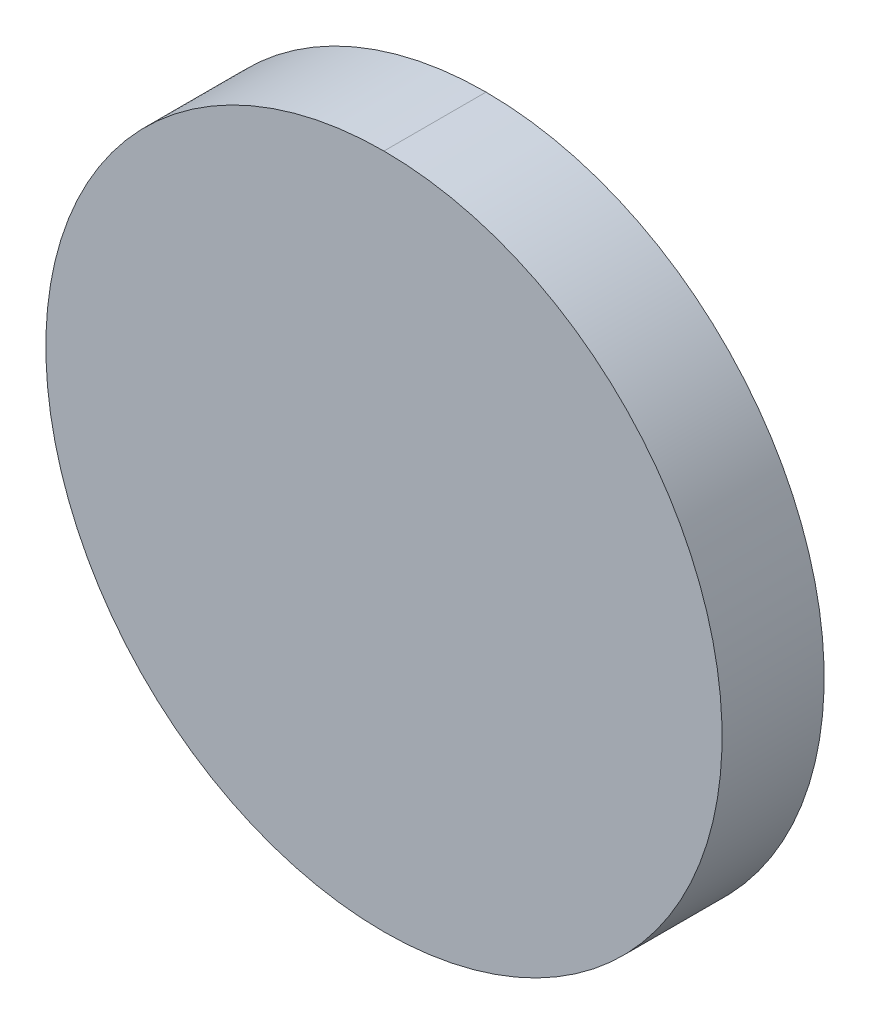
ISO-10303-21;
HEADER;
FILE_DESCRIPTION(('STEP AP214'),'2;1');
FILE_NAME('part.step','',(''),(''),'','','');
FILE_SCHEMA(('AUTOMOTIVE_DESIGN { 1 0 10303 214 1 1 1 1 }'));
ENDSEC;
DATA;
#1=APPLICATION_CONTEXT('core data for automotive mechanical design processes');
#2=APPLICATION_PROTOCOL_DEFINITION('international standard','automotive_design',2000,#1);
#3=PRODUCT_CONTEXT('',#1,'mechanical');
#4=PRODUCT('Part','Part','',(#3));
#5=PRODUCT_RELATED_PRODUCT_CATEGORY('part','',(#4));
#6=PRODUCT_DEFINITION_FORMATION('','',#4);
#7=PRODUCT_DEFINITION_CONTEXT('part definition',#1,'design');
#8=PRODUCT_DEFINITION('design','',#6,#7);
#9=PRODUCT_DEFINITION_SHAPE('','',#8);
#10=(LENGTH_UNIT() NAMED_UNIT(*) SI_UNIT(.MILLI.,.METRE.));
#11=(NAMED_UNIT(*) PLANE_ANGLE_UNIT() SI_UNIT($,.RADIAN.));
#12=(NAMED_UNIT(*) SI_UNIT($,.STERADIAN.) SOLID_ANGLE_UNIT());
#13=UNCERTAINTY_MEASURE_WITH_UNIT(LENGTH_MEASURE(1.E-05),#10,'distance_accuracy_value','');
#14=(GEOMETRIC_REPRESENTATION_CONTEXT(3) GLOBAL_UNCERTAINTY_ASSIGNED_CONTEXT((#13)) GLOBAL_UNIT_ASSIGNED_CONTEXT((#10,
#11,#12)) REPRESENTATION_CONTEXT('',''));
#15=CARTESIAN_POINT('',(0.,0.,0.));
#16=DIRECTION('',(0.,0.,1.));
#17=DIRECTION('',(1.,0.,0.));
#18=AXIS2_PLACEMENT_3D('',#15,#16,#17);
#19=CARTESIAN_POINT('',(-275.6665265136,235.0245785127,-5.145));
#20=DIRECTION('',(0.,0.,-1.));
#21=DIRECTION('',(0.,1.,0.));
#22=AXIS2_PLACEMENT_3D('',#19,#20,#21);
#23=CYLINDRICAL_SURFACE('',#22,1.325);
#24=CARTESIAN_POINT('',(-275.6665265136,235.0245785127,-4.4));
#25=DIRECTION('',(0.,0.,1.));
#26=DIRECTION('',(0.,-1.,0.));
#27=AXIS2_PLACEMENT_3D('',#24,#25,#26);
#28=CIRCLE('',#27,1.325);
#29=CARTESIAN_POINT('',(-275.6665265136,233.6995785127,-4.4));
#30=VERTEX_POINT('',#29);
#31=CARTESIAN_POINT('',(-275.6665265136,236.3495785127,-4.4));
#32=VERTEX_POINT('',#31);
#33=EDGE_CURVE('E11',#30,#32,#28,.T.);
#34=ORIENTED_EDGE('',*,*,#33,.F.);
#35=DIRECTION('',(0.,0.,1.));
#36=VECTOR('',#35,1.);
#37=CARTESIAN_POINT('',(-275.6665265136,233.6995785127,-4.8));
#38=LINE('',#37,#36);
#39=CARTESIAN_POINT('',(-275.6665265136,233.6995785127,-4.8));
#40=VERTEX_POINT('',#39);
#41=EDGE_CURVE('E48',#40,#30,#38,.T.);
#42=ORIENTED_EDGE('',*,*,#41,.F.);
#43=CARTESIAN_POINT('',(-275.6665265136,235.0245785127,-4.8));
#44=DIRECTION('',(0.,0.,-1.));
#45=DIRECTION('',(0.,1.,0.));
#46=AXIS2_PLACEMENT_3D('',#43,#44,#45);
#47=CIRCLE('',#46,1.325);
#48=CARTESIAN_POINT('',(-275.6665265136,236.3495785127,-4.8));
#49=VERTEX_POINT('',#48);
#50=EDGE_CURVE('E52',#49,#40,#47,.T.);
#51=ORIENTED_EDGE('',*,*,#50,.F.);
#52=DIRECTION('',(0.,0.,1.));
#53=VECTOR('',#52,1.);
#54=CARTESIAN_POINT('',(-275.6665265136,236.3495785127,-4.8));
#55=LINE('',#54,#53);
#56=EDGE_CURVE('E40',#49,#32,#55,.T.);
#57=ORIENTED_EDGE('',*,*,#56,.T.);
#58=EDGE_LOOP('',(#34,#42,#51,#57));
#59=FACE_BOUND('',#58,.T.);
#60=ADVANCED_FACE('F16',(#59),#23,.T.);
#61=CARTESIAN_POINT('',(-217.6751787571,251.8245785125,-4.4));
#62=DIRECTION('',(0.,0.,-1.));
#63=DIRECTION('',(0.,-1.,0.));
#64=AXIS2_PLACEMENT_3D('',#61,#62,#63);
#65=PLANE('',#64);
#66=ORIENTED_EDGE('',*,*,#33,.T.);
#67=CARTESIAN_POINT('',(-275.6665265136,235.0245785127,-4.4));
#68=DIRECTION('',(0.,0.,1.));
#69=DIRECTION('',(0.,1.,0.));
#70=AXIS2_PLACEMENT_3D('',#67,#68,#69);
#71=CIRCLE('',#70,1.325);
#72=EDGE_CURVE('E24',#32,#30,#71,.T.);
#73=ORIENTED_EDGE('',*,*,#72,.T.);
#74=EDGE_LOOP('',(#66,#73));
#75=FACE_BOUND('',#74,.T.);
#76=ADVANCED_FACE('F65',(#75),#65,.F.);
#77=CARTESIAN_POINT('',(-275.6665265136,235.0245785127,-5.145));
#78=DIRECTION('',(0.,0.,-1.));
#79=DIRECTION('',(0.,1.,0.));
#80=AXIS2_PLACEMENT_3D('',#77,#78,#79);
#81=CYLINDRICAL_SURFACE('',#80,1.325);
#82=ORIENTED_EDGE('',*,*,#56,.F.);
#83=CARTESIAN_POINT('',(-275.6665265136,235.0245785127,-4.8));
#84=DIRECTION('',(0.,0.,-1.));
#85=DIRECTION('',(0.,-1.,0.));
#86=AXIS2_PLACEMENT_3D('',#83,#84,#85);
#87=CIRCLE('',#86,1.325);
#88=EDGE_CURVE('E44',#40,#49,#87,.T.);
#89=ORIENTED_EDGE('',*,*,#88,.F.);
#90=ORIENTED_EDGE('',*,*,#41,.T.);
#91=ORIENTED_EDGE('',*,*,#72,.F.);
#92=EDGE_LOOP('',(#82,#89,#90,#91));
#93=FACE_BOUND('',#92,.T.);
#94=ADVANCED_FACE('F42',(#93),#81,.T.);
#95=CARTESIAN_POINT('',(-217.6751787571,251.8245785125,-4.8));
#96=DIRECTION('',(0.,0.,-1.));
#97=DIRECTION('',(0.,-1.,0.));
#98=AXIS2_PLACEMENT_3D('',#95,#96,#97);
#99=PLANE('',#98);
#100=ORIENTED_EDGE('',*,*,#50,.T.);
#101=ORIENTED_EDGE('',*,*,#88,.T.);
#102=EDGE_LOOP('',(#100,#101));
#103=FACE_BOUND('',#102,.T.);
#104=ADVANCED_FACE('F51',(#103),#99,.T.);
#105=CLOSED_SHELL('',(#60,#76,#94,#104));
#106=MANIFOLD_SOLID_BREP('B1',#105);
#107=ADVANCED_BREP_SHAPE_REPRESENTATION('',(#18,#106),#14);
#108=SHAPE_DEFINITION_REPRESENTATION(#9,#107);
ENDSEC;
END-ISO-10303-21;
